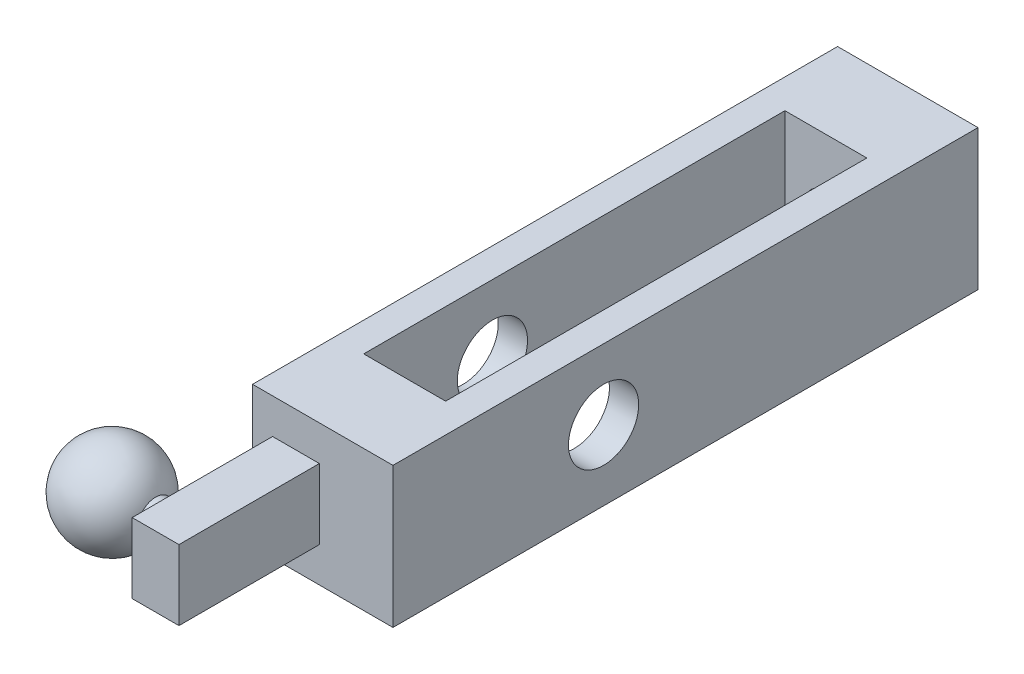
ISO-10303-21;
HEADER;
FILE_DESCRIPTION(('STEP AP214'),'2;1');
FILE_NAME('part.step','',(''),(''),'','','');
FILE_SCHEMA(('AUTOMOTIVE_DESIGN { 1 0 10303 214 1 1 1 1 }'));
ENDSEC;
DATA;
#1=APPLICATION_CONTEXT('core data for automotive mechanical design processes');
#2=APPLICATION_PROTOCOL_DEFINITION('international standard','automotive_design',2000,#1);
#3=PRODUCT_CONTEXT('',#1,'mechanical');
#4=PRODUCT('Part','Part','',(#3));
#5=PRODUCT_RELATED_PRODUCT_CATEGORY('part','',(#4));
#6=PRODUCT_DEFINITION_FORMATION('','',#4);
#7=PRODUCT_DEFINITION_CONTEXT('part definition',#1,'design');
#8=PRODUCT_DEFINITION('design','',#6,#7);
#9=PRODUCT_DEFINITION_SHAPE('','',#8);
#10=(LENGTH_UNIT() NAMED_UNIT(*) SI_UNIT(.MILLI.,.METRE.));
#11=(NAMED_UNIT(*) PLANE_ANGLE_UNIT() SI_UNIT($,.RADIAN.));
#12=(NAMED_UNIT(*) SI_UNIT($,.STERADIAN.) SOLID_ANGLE_UNIT());
#13=UNCERTAINTY_MEASURE_WITH_UNIT(LENGTH_MEASURE(1.E-05),#10,'distance_accuracy_value','');
#14=(GEOMETRIC_REPRESENTATION_CONTEXT(3) GLOBAL_UNCERTAINTY_ASSIGNED_CONTEXT((#13)) GLOBAL_UNIT_ASSIGNED_CONTEXT((#10,
#11,#12)) REPRESENTATION_CONTEXT('',''));
#15=CARTESIAN_POINT('',(0.,0.,0.));
#16=DIRECTION('',(0.,0.,1.));
#17=DIRECTION('',(1.,0.,0.));
#18=AXIS2_PLACEMENT_3D('',#15,#16,#17);
#19=CARTESIAN_POINT('',(3.,-3.,25.));
#20=DIRECTION('',(0.,1.,0.));
#21=DIRECTION('',(-1.,0.,0.));
#22=AXIS2_PLACEMENT_3D('',#19,#20,#21);
#23=PLANE('',#22);
#24=DIRECTION('',(1.,0.,0.));
#25=VECTOR('',#24,1.);
#26=CARTESIAN_POINT('',(3.,-3.,0.));
#27=LINE('',#26,#25);
#28=CARTESIAN_POINT('',(-3.,-3.,0.));
#29=VERTEX_POINT('',#28);
#30=CARTESIAN_POINT('',(3.,-3.,0.));
#31=VERTEX_POINT('',#30);
#32=EDGE_CURVE('E218',#29,#31,#27,.T.);
#33=ORIENTED_EDGE('',*,*,#32,.T.);
#34=DIRECTION('',(0.,0.,-1.));
#35=VECTOR('',#34,1.);
#36=CARTESIAN_POINT('',(3.,-3.,25.));
#37=LINE('',#36,#35);
#38=CARTESIAN_POINT('',(3.,-3.,25.));
#39=VERTEX_POINT('',#38);
#40=EDGE_CURVE('E228',#39,#31,#37,.T.);
#41=ORIENTED_EDGE('',*,*,#40,.F.);
#42=DIRECTION('',(1.,0.,0.));
#43=VECTOR('',#42,1.);
#44=CARTESIAN_POINT('',(3.,-3.,25.));
#45=LINE('',#44,#43);
#46=CARTESIAN_POINT('',(-3.,-3.,25.));
#47=VERTEX_POINT('',#46);
#48=EDGE_CURVE('E208',#47,#39,#45,.T.);
#49=ORIENTED_EDGE('',*,*,#48,.F.);
#50=DIRECTION('',(0.,0.,-1.));
#51=VECTOR('',#50,1.);
#52=CARTESIAN_POINT('',(-3.,-3.,25.));
#53=LINE('',#52,#51);
#54=EDGE_CURVE('E50',#47,#29,#53,.T.);
#55=ORIENTED_EDGE('',*,*,#54,.T.);
#56=EDGE_LOOP('',(#33,#41,#49,#55));
#57=FACE_BOUND('',#56,.T.);
#58=DIRECTION('',(1.,0.,0.));
#59=VECTOR('',#58,1.);
#60=CARTESIAN_POINT('',(3.,-3.,3.5));
#61=LINE('',#60,#59);
#62=CARTESIAN_POINT('',(-1.75,-3.,3.5));
#63=VERTEX_POINT('',#62);
#64=CARTESIAN_POINT('',(1.75,-3.,3.5));
#65=VERTEX_POINT('',#64);
#66=EDGE_CURVE('E135',#63,#65,#61,.T.);
#67=ORIENTED_EDGE('',*,*,#66,.F.);
#68=DIRECTION('',(0.,0.,-1.));
#69=VECTOR('',#68,1.);
#70=CARTESIAN_POINT('',(-1.75,-3.,25.));
#71=LINE('',#70,#69);
#72=CARTESIAN_POINT('',(-1.75,-3.,21.5));
#73=VERTEX_POINT('',#72);
#74=EDGE_CURVE('E138',#73,#63,#71,.T.);
#75=ORIENTED_EDGE('',*,*,#74,.F.);
#76=DIRECTION('',(-1.,0.,0.));
#77=VECTOR('',#76,1.);
#78=CARTESIAN_POINT('',(3.,-3.,21.5));
#79=LINE('',#78,#77);
#80=CARTESIAN_POINT('',(1.75,-3.,21.5));
#81=VERTEX_POINT('',#80);
#82=EDGE_CURVE('E167',#81,#73,#79,.T.);
#83=ORIENTED_EDGE('',*,*,#82,.F.);
#84=DIRECTION('',(0.,0.,1.));
#85=VECTOR('',#84,1.);
#86=CARTESIAN_POINT('',(1.75,-3.,25.));
#87=LINE('',#86,#85);
#88=EDGE_CURVE('E169',#65,#81,#87,.T.);
#89=ORIENTED_EDGE('',*,*,#88,.F.);
#90=EDGE_LOOP('',(#67,#75,#83,#89));
#91=FACE_BOUND('',#90,.T.);
#92=ADVANCED_FACE('F41',(#57,#91),#23,.F.);
#93=CARTESIAN_POINT('',(3.,3.,25.));
#94=DIRECTION('',(0.,-1.,0.));
#95=DIRECTION('',(1.,0.,0.));
#96=AXIS2_PLACEMENT_3D('',#93,#94,#95);
#97=PLANE('',#96);
#98=DIRECTION('',(-1.,0.,0.));
#99=VECTOR('',#98,1.);
#100=CARTESIAN_POINT('',(3.,3.,0.));
#101=LINE('',#100,#99);
#102=CARTESIAN_POINT('',(3.,3.,0.));
#103=VERTEX_POINT('',#102);
#104=CARTESIAN_POINT('',(-3.,3.,0.));
#105=VERTEX_POINT('',#104);
#106=EDGE_CURVE('E209',#103,#105,#101,.T.);
#107=ORIENTED_EDGE('',*,*,#106,.T.);
#108=DIRECTION('',(0.,0.,-1.));
#109=VECTOR('',#108,1.);
#110=CARTESIAN_POINT('',(-3.,3.,25.));
#111=LINE('',#110,#109);
#112=CARTESIAN_POINT('',(-3.,3.,25.));
#113=VERTEX_POINT('',#112);
#114=EDGE_CURVE('E215',#113,#105,#111,.T.);
#115=ORIENTED_EDGE('',*,*,#114,.F.);
#116=DIRECTION('',(-1.,0.,0.));
#117=VECTOR('',#116,1.);
#118=CARTESIAN_POINT('',(3.,3.,25.));
#119=LINE('',#118,#117);
#120=CARTESIAN_POINT('',(3.,3.,25.));
#121=VERTEX_POINT('',#120);
#122=EDGE_CURVE('E213',#121,#113,#119,.T.);
#123=ORIENTED_EDGE('',*,*,#122,.F.);
#124=DIRECTION('',(0.,0.,-1.));
#125=VECTOR('',#124,1.);
#126=CARTESIAN_POINT('',(3.,3.,25.));
#127=LINE('',#126,#125);
#128=EDGE_CURVE('E225',#121,#103,#127,.T.);
#129=ORIENTED_EDGE('',*,*,#128,.T.);
#130=EDGE_LOOP('',(#107,#115,#123,#129));
#131=FACE_BOUND('',#130,.T.);
#132=DIRECTION('',(1.,0.,0.));
#133=VECTOR('',#132,1.);
#134=CARTESIAN_POINT('',(-1.75,3.,3.5));
#135=LINE('',#134,#133);
#136=CARTESIAN_POINT('',(-1.75,3.,3.5));
#137=VERTEX_POINT('',#136);
#138=CARTESIAN_POINT('',(1.75,3.,3.5));
#139=VERTEX_POINT('',#138);
#140=EDGE_CURVE('E66',#137,#139,#135,.T.);
#141=ORIENTED_EDGE('',*,*,#140,.T.);
#142=DIRECTION('',(0.,0.,1.));
#143=VECTOR('',#142,1.);
#144=CARTESIAN_POINT('',(1.75,3.,3.5));
#145=LINE('',#144,#143);
#146=CARTESIAN_POINT('',(1.75,3.,21.5));
#147=VERTEX_POINT('',#146);
#148=EDGE_CURVE('E142',#139,#147,#145,.T.);
#149=ORIENTED_EDGE('',*,*,#148,.T.);
#150=DIRECTION('',(-1.,0.,0.));
#151=VECTOR('',#150,1.);
#152=CARTESIAN_POINT('',(-1.75,3.,21.5));
#153=LINE('',#152,#151);
#154=CARTESIAN_POINT('',(-1.75,3.,21.5));
#155=VERTEX_POINT('',#154);
#156=EDGE_CURVE('E148',#147,#155,#153,.T.);
#157=ORIENTED_EDGE('',*,*,#156,.T.);
#158=DIRECTION('',(0.,0.,-1.));
#159=VECTOR('',#158,1.);
#160=CARTESIAN_POINT('',(-1.75,3.,3.5));
#161=LINE('',#160,#159);
#162=EDGE_CURVE('E152',#155,#137,#161,.T.);
#163=ORIENTED_EDGE('',*,*,#162,.T.);
#164=EDGE_LOOP('',(#141,#149,#157,#163));
#165=FACE_BOUND('',#164,.T.);
#166=ADVANCED_FACE('F151',(#131,#165),#97,.F.);
#167=CARTESIAN_POINT('',(0.,0.,25.));
#168=DIRECTION('',(0.,0.,1.));
#169=DIRECTION('',(1.,0.,0.));
#170=AXIS2_PLACEMENT_3D('',#167,#168,#169);
#171=PLANE('',#170);
#172=DIRECTION('',(0.,-1.,0.));
#173=VECTOR('',#172,1.);
#174=CARTESIAN_POINT('',(-3.,-3.,25.));
#175=LINE('',#174,#173);
#176=EDGE_CURVE('E205',#113,#47,#175,.T.);
#177=ORIENTED_EDGE('',*,*,#176,.T.);
#178=ORIENTED_EDGE('',*,*,#48,.T.);
#179=DIRECTION('',(0.,1.,0.));
#180=VECTOR('',#179,1.);
#181=CARTESIAN_POINT('',(3.,-3.,25.));
#182=LINE('',#181,#180);
#183=EDGE_CURVE('E211',#39,#121,#182,.T.);
#184=ORIENTED_EDGE('',*,*,#183,.T.);
#185=ORIENTED_EDGE('',*,*,#122,.T.);
#186=EDGE_LOOP('',(#177,#178,#184,#185));
#187=FACE_BOUND('',#186,.T.);
#188=DIRECTION('',(-1.,0.,0.));
#189=VECTOR('',#188,1.);
#190=CARTESIAN_POINT('',(-2.14479354998716,1.49545918544692,25.));
#191=LINE('',#190,#189);
#192=CARTESIAN_POINT('',(-0.144793549987163,1.49545918544692,25.));
#193=VERTEX_POINT('',#192);
#194=CARTESIAN_POINT('',(-2.14479354998716,1.49545918544692,25.));
#195=VERTEX_POINT('',#194);
#196=EDGE_CURVE('E189',#193,#195,#191,.T.);
#197=ORIENTED_EDGE('',*,*,#196,.F.);
#198=DIRECTION('',(0.,1.,0.));
#199=VECTOR('',#198,1.);
#200=CARTESIAN_POINT('',(-0.144793549987163,1.49545918544692,25.));
#201=LINE('',#200,#199);
#202=CARTESIAN_POINT('',(-0.144793549987163,-1.50454081455308,25.));
#203=VERTEX_POINT('',#202);
#204=EDGE_CURVE('E175',#203,#193,#201,.T.);
#205=ORIENTED_EDGE('',*,*,#204,.F.);
#206=DIRECTION('',(1.,0.,0.));
#207=VECTOR('',#206,1.);
#208=CARTESIAN_POINT('',(-2.14479354998716,-1.50454081455308,25.));
#209=LINE('',#208,#207);
#210=CARTESIAN_POINT('',(-2.14479354998716,-1.50454081455308,25.));
#211=VERTEX_POINT('',#210);
#212=EDGE_CURVE('E180',#211,#203,#209,.T.);
#213=ORIENTED_EDGE('',*,*,#212,.F.);
#214=DIRECTION('',(0.,-1.,0.));
#215=VECTOR('',#214,1.);
#216=CARTESIAN_POINT('',(-2.14479354998716,1.49545918544692,25.));
#217=LINE('',#216,#215);
#218=EDGE_CURVE('E191',#195,#211,#217,.T.);
#219=ORIENTED_EDGE('',*,*,#218,.F.);
#220=EDGE_LOOP('',(#197,#205,#213,#219));
#221=FACE_BOUND('',#220,.T.);
#222=ADVANCED_FACE('F272',(#187,#221),#171,.T.);
#223=CARTESIAN_POINT('',(-3.,-3.,25.));
#224=DIRECTION('',(1.,0.,0.));
#225=DIRECTION('',(0.,0.,-1.));
#226=AXIS2_PLACEMENT_3D('',#223,#224,#225);
#227=PLANE('',#226);
#228=CARTESIAN_POINT('',(-3.,0.,16.));
#229=DIRECTION('',(-1.,0.,0.));
#230=DIRECTION('',(0.,0.,1.));
#231=AXIS2_PLACEMENT_3D('',#228,#229,#230);
#232=CIRCLE('',#231,1.5);
#233=CARTESIAN_POINT('',(-3.,0.,17.5));
#234=VERTEX_POINT('',#233);
#235=EDGE_CURVE('E234',#234,#234,#232,.T.);
#236=ORIENTED_EDGE('',*,*,#235,.F.);
#237=EDGE_LOOP('',(#236));
#238=FACE_BOUND('',#237,.T.);
#239=DIRECTION('',(0.,-1.,0.));
#240=VECTOR('',#239,1.);
#241=CARTESIAN_POINT('',(-3.,-3.,0.));
#242=LINE('',#241,#240);
#243=EDGE_CURVE('E204',#105,#29,#242,.T.);
#244=ORIENTED_EDGE('',*,*,#243,.T.);
#245=ORIENTED_EDGE('',*,*,#54,.F.);
#246=ORIENTED_EDGE('',*,*,#176,.F.);
#247=ORIENTED_EDGE('',*,*,#114,.T.);
#248=EDGE_LOOP('',(#244,#245,#246,#247));
#249=FACE_BOUND('',#248,.T.);
#250=ADVANCED_FACE('F43',(#238,#249),#227,.F.);
#251=CARTESIAN_POINT('',(3.,-3.,25.));
#252=DIRECTION('',(-1.,0.,0.));
#253=DIRECTION('',(0.,0.,1.));
#254=AXIS2_PLACEMENT_3D('',#251,#252,#253);
#255=PLANE('',#254);
#256=CARTESIAN_POINT('',(3.,0.,16.));
#257=DIRECTION('',(-1.,0.,0.));
#258=DIRECTION('',(0.,0.,1.));
#259=AXIS2_PLACEMENT_3D('',#256,#257,#258);
#260=CIRCLE('',#259,1.5);
#261=CARTESIAN_POINT('',(3.,0.,17.5));
#262=VERTEX_POINT('',#261);
#263=EDGE_CURVE('E153',#262,#262,#260,.T.);
#264=ORIENTED_EDGE('',*,*,#263,.T.);
#265=EDGE_LOOP('',(#264));
#266=FACE_BOUND('',#265,.T.);
#267=DIRECTION('',(0.,1.,0.));
#268=VECTOR('',#267,1.);
#269=CARTESIAN_POINT('',(3.,-3.,0.));
#270=LINE('',#269,#268);
#271=EDGE_CURVE('E220',#31,#103,#270,.T.);
#272=ORIENTED_EDGE('',*,*,#271,.T.);
#273=ORIENTED_EDGE('',*,*,#128,.F.);
#274=ORIENTED_EDGE('',*,*,#183,.F.);
#275=ORIENTED_EDGE('',*,*,#40,.T.);
#276=EDGE_LOOP('',(#272,#273,#274,#275));
#277=FACE_BOUND('',#276,.T.);
#278=ADVANCED_FACE('F254',(#266,#277),#255,.F.);
#279=CARTESIAN_POINT('',(0.,0.,0.));
#280=DIRECTION('',(0.,0.,1.));
#281=DIRECTION('',(1.,0.,0.));
#282=AXIS2_PLACEMENT_3D('',#279,#280,#281);
#283=PLANE('',#282);
#284=CARTESIAN_POINT('',(0.,0.,0.));
#285=DIRECTION('',(0.,0.,-1.));
#286=DIRECTION('',(-1.,0.,0.));
#287=AXIS2_PLACEMENT_3D('',#284,#285,#286);
#288=CIRCLE('',#287,0.9);
#289=CARTESIAN_POINT('',(-0.9,0.,0.));
#290=VERTEX_POINT('',#289);
#291=EDGE_CURVE('E243',#290,#290,#288,.T.);
#292=ORIENTED_EDGE('',*,*,#291,.F.);
#293=EDGE_LOOP('',(#292));
#294=FACE_BOUND('',#293,.T.);
#295=ORIENTED_EDGE('',*,*,#243,.F.);
#296=ORIENTED_EDGE('',*,*,#106,.F.);
#297=ORIENTED_EDGE('',*,*,#271,.F.);
#298=ORIENTED_EDGE('',*,*,#32,.F.);
#299=EDGE_LOOP('',(#295,#296,#297,#298));
#300=FACE_BOUND('',#299,.T.);
#301=ADVANCED_FACE('F250',(#294,#300),#283,.F.);
#302=CARTESIAN_POINT('',(-0.144793549987163,1.49545918544692,31.));
#303=DIRECTION('',(-1.,0.,0.));
#304=DIRECTION('',(0.,-1.,0.));
#305=AXIS2_PLACEMENT_3D('',#302,#303,#304);
#306=PLANE('',#305);
#307=ORIENTED_EDGE('',*,*,#204,.T.);
#308=DIRECTION('',(0.,0.,-1.));
#309=VECTOR('',#308,1.);
#310=CARTESIAN_POINT('',(-0.144793549987163,1.49545918544692,31.));
#311=LINE('',#310,#309);
#312=CARTESIAN_POINT('',(-0.144793549987163,1.49545918544692,31.));
#313=VERTEX_POINT('',#312);
#314=EDGE_CURVE('E202',#313,#193,#311,.T.);
#315=ORIENTED_EDGE('',*,*,#314,.F.);
#316=DIRECTION('',(0.,1.,0.));
#317=VECTOR('',#316,1.);
#318=CARTESIAN_POINT('',(-0.144793549987163,1.49545918544692,31.));
#319=LINE('',#318,#317);
#320=CARTESIAN_POINT('',(-0.144793549987163,-1.50454081455308,31.));
#321=VERTEX_POINT('',#320);
#322=EDGE_CURVE('E176',#321,#313,#319,.T.);
#323=ORIENTED_EDGE('',*,*,#322,.F.);
#324=DIRECTION('',(0.,0.,-1.));
#325=VECTOR('',#324,1.);
#326=CARTESIAN_POINT('',(-0.144793549987163,-1.50454081455308,31.));
#327=LINE('',#326,#325);
#328=EDGE_CURVE('E186',#321,#203,#327,.T.);
#329=ORIENTED_EDGE('',*,*,#328,.T.);
#330=EDGE_LOOP('',(#307,#315,#323,#329));
#331=FACE_BOUND('',#330,.T.);
#332=ADVANCED_FACE('F253',(#331),#306,.F.);
#333=CARTESIAN_POINT('',(-2.14479354998716,1.49545918544692,31.));
#334=DIRECTION('',(0.,-1.,0.));
#335=DIRECTION('',(1.,0.,0.));
#336=AXIS2_PLACEMENT_3D('',#333,#334,#335);
#337=PLANE('',#336);
#338=ORIENTED_EDGE('',*,*,#196,.T.);
#339=DIRECTION('',(0.,0.,-1.));
#340=VECTOR('',#339,1.);
#341=CARTESIAN_POINT('',(-2.14479354998716,1.49545918544692,31.));
#342=LINE('',#341,#340);
#343=CARTESIAN_POINT('',(-2.14479354998716,1.49545918544692,31.));
#344=VERTEX_POINT('',#343);
#345=EDGE_CURVE('E199',#344,#195,#342,.T.);
#346=ORIENTED_EDGE('',*,*,#345,.F.);
#347=DIRECTION('',(-1.,0.,0.));
#348=VECTOR('',#347,1.);
#349=CARTESIAN_POINT('',(-2.14479354998716,1.49545918544692,31.));
#350=LINE('',#349,#348);
#351=EDGE_CURVE('E179',#313,#344,#350,.T.);
#352=ORIENTED_EDGE('',*,*,#351,.F.);
#353=ORIENTED_EDGE('',*,*,#314,.T.);
#354=EDGE_LOOP('',(#338,#346,#352,#353));
#355=FACE_BOUND('',#354,.T.);
#356=ADVANCED_FACE('F282',(#355),#337,.F.);
#357=CARTESIAN_POINT('',(-2.14479354998716,1.49545918544692,31.));
#358=DIRECTION('',(1.,0.,0.));
#359=DIRECTION('',(0.,1.,0.));
#360=AXIS2_PLACEMENT_3D('',#357,#358,#359);
#361=PLANE('',#360);
#362=CARTESIAN_POINT('',(-2.14479354998716,0.,29.));
#363=DIRECTION('',(1.,0.,0.));
#364=DIRECTION('',(0.,1.,0.));
#365=AXIS2_PLACEMENT_3D('',#362,#363,#364);
#366=CIRCLE('',#365,0.750000000000002);
#367=CARTESIAN_POINT('',(-2.14479354998716,0.750000000000002,29.));
#368=VERTEX_POINT('',#367);
#369=EDGE_CURVE('E11',#368,#368,#366,.F.);
#370=ORIENTED_EDGE('',*,*,#369,.F.);
#371=EDGE_LOOP('',(#370));
#372=FACE_BOUND('',#371,.T.);
#373=ORIENTED_EDGE('',*,*,#218,.T.);
#374=DIRECTION('',(0.,0.,-1.));
#375=VECTOR('',#374,1.);
#376=CARTESIAN_POINT('',(-2.14479354998716,-1.50454081455308,31.));
#377=LINE('',#376,#375);
#378=CARTESIAN_POINT('',(-2.14479354998716,-1.50454081455308,31.));
#379=VERTEX_POINT('',#378);
#380=EDGE_CURVE('E197',#379,#211,#377,.T.);
#381=ORIENTED_EDGE('',*,*,#380,.F.);
#382=DIRECTION('',(0.,-1.,0.));
#383=VECTOR('',#382,1.);
#384=CARTESIAN_POINT('',(-2.14479354998716,1.49545918544692,31.));
#385=LINE('',#384,#383);
#386=EDGE_CURVE('E182',#344,#379,#385,.T.);
#387=ORIENTED_EDGE('',*,*,#386,.F.);
#388=ORIENTED_EDGE('',*,*,#345,.T.);
#389=EDGE_LOOP('',(#373,#381,#387,#388));
#390=FACE_BOUND('',#389,.T.);
#391=ADVANCED_FACE('F286',(#372,#390),#361,.F.);
#392=CARTESIAN_POINT('',(-2.14479354998716,-1.50454081455308,31.));
#393=DIRECTION('',(0.,1.,0.));
#394=DIRECTION('',(-1.,0.,0.));
#395=AXIS2_PLACEMENT_3D('',#392,#393,#394);
#396=PLANE('',#395);
#397=ORIENTED_EDGE('',*,*,#212,.T.);
#398=ORIENTED_EDGE('',*,*,#328,.F.);
#399=DIRECTION('',(1.,0.,0.));
#400=VECTOR('',#399,1.);
#401=CARTESIAN_POINT('',(-2.14479354998716,-1.50454081455308,31.));
#402=LINE('',#401,#400);
#403=EDGE_CURVE('E184',#379,#321,#402,.T.);
#404=ORIENTED_EDGE('',*,*,#403,.F.);
#405=ORIENTED_EDGE('',*,*,#380,.T.);
#406=EDGE_LOOP('',(#397,#398,#404,#405));
#407=FACE_BOUND('',#406,.T.);
#408=ADVANCED_FACE('F295',(#407),#396,.F.);
#409=CARTESIAN_POINT('',(0.,0.,31.));
#410=DIRECTION('',(0.,0.,1.));
#411=DIRECTION('',(1.,0.,0.));
#412=AXIS2_PLACEMENT_3D('',#409,#410,#411);
#413=PLANE('',#412);
#414=ORIENTED_EDGE('',*,*,#322,.T.);
#415=ORIENTED_EDGE('',*,*,#351,.T.);
#416=ORIENTED_EDGE('',*,*,#386,.T.);
#417=ORIENTED_EDGE('',*,*,#403,.T.);
#418=EDGE_LOOP('',(#414,#415,#416,#417));
#419=FACE_BOUND('',#418,.T.);
#420=ADVANCED_FACE('F290',(#419),#413,.T.);
#421=CARTESIAN_POINT('',(-3.14479354998716,0.,29.));
#422=DIRECTION('',(1.,0.,0.));
#423=DIRECTION('',(0.,1.,0.));
#424=AXIS2_PLACEMENT_3D('',#421,#422,#423);
#425=CYLINDRICAL_SURFACE('',#424,0.750000000000002);
#426=CARTESIAN_POINT('',(-3.14479354998716,0.,29.));
#427=DIRECTION('',(-1.,0.,0.));
#428=DIRECTION('',(0.,-1.,0.));
#429=AXIS2_PLACEMENT_3D('',#426,#427,#428);
#430=CIRCLE('',#429,0.750000000000002);
#431=CARTESIAN_POINT('',(-3.14479354998716,-0.750000000000002,29.));
#432=VERTEX_POINT('',#431);
#433=EDGE_CURVE('E172',#432,#432,#430,.T.);
#434=ORIENTED_EDGE('',*,*,#433,.F.);
#435=EDGE_LOOP('',(#434));
#436=FACE_BOUND('',#435,.T.);
#437=ORIENTED_EDGE('',*,*,#369,.T.);
#438=EDGE_LOOP('',(#437));
#439=FACE_BOUND('',#438,.T.);
#440=ADVANCED_FACE('F302',(#436,#439),#425,.T.);
#441=CARTESIAN_POINT('',(-4.99884317176108,0.,29.));
#442=DIRECTION('',(1.,0.,0.));
#443=DIRECTION('',(0.,0.,-1.));
#444=AXIS2_PLACEMENT_3D('',#441,#442,#443);
#445=SPHERICAL_SURFACE('',#444,2.);
#446=ORIENTED_EDGE('',*,*,#433,.T.);
#447=EDGE_LOOP('',(#446));
#448=FACE_BOUND('',#447,.T.);
#449=ADVANCED_FACE('F360',(#448),#445,.T.);
#450=CARTESIAN_POINT('',(-1.75,-5.,3.5));
#451=DIRECTION('',(0.,0.,1.));
#452=DIRECTION('',(1.,0.,0.));
#453=AXIS2_PLACEMENT_3D('',#450,#451,#452);
#454=PLANE('',#453);
#455=CARTESIAN_POINT('',(0.,0.,3.5));
#456=DIRECTION('',(0.,0.,1.));
#457=DIRECTION('',(1.,0.,0.));
#458=AXIS2_PLACEMENT_3D('',#455,#456,#457);
#459=CIRCLE('',#458,0.9);
#460=CARTESIAN_POINT('',(0.9,0.,3.5));
#461=VERTEX_POINT('',#460);
#462=EDGE_CURVE('E45',#461,#461,#459,.T.);
#463=ORIENTED_EDGE('',*,*,#462,.F.);
#464=EDGE_LOOP('',(#463));
#465=FACE_BOUND('',#464,.T.);
#466=ORIENTED_EDGE('',*,*,#66,.T.);
#467=DIRECTION('',(0.,1.,0.));
#468=VECTOR('',#467,1.);
#469=CARTESIAN_POINT('',(1.75,-5.,3.5));
#470=LINE('',#469,#468);
#471=EDGE_CURVE('E131',#65,#139,#470,.T.);
#472=ORIENTED_EDGE('',*,*,#471,.T.);
#473=ORIENTED_EDGE('',*,*,#140,.F.);
#474=DIRECTION('',(0.,1.,0.));
#475=VECTOR('',#474,1.);
#476=CARTESIAN_POINT('',(-1.75,-5.,3.5));
#477=LINE('',#476,#475);
#478=EDGE_CURVE('E162',#63,#137,#477,.T.);
#479=ORIENTED_EDGE('',*,*,#478,.F.);
#480=EDGE_LOOP('',(#466,#472,#473,#479));
#481=FACE_BOUND('',#480,.T.);
#482=ADVANCED_FACE('F133',(#465,#481),#454,.T.);
#483=CARTESIAN_POINT('',(1.75,-5.,3.5));
#484=DIRECTION('',(-1.,0.,0.));
#485=DIRECTION('',(0.,-1.,0.));
#486=AXIS2_PLACEMENT_3D('',#483,#484,#485);
#487=PLANE('',#486);
#488=CARTESIAN_POINT('',(1.75,0.,16.));
#489=DIRECTION('',(-1.,0.,0.));
#490=DIRECTION('',(0.,-1.,0.));
#491=AXIS2_PLACEMENT_3D('',#488,#489,#490);
#492=CIRCLE('',#491,1.5);
#493=CARTESIAN_POINT('',(1.75,-1.5,16.));
#494=VERTEX_POINT('',#493);
#495=EDGE_CURVE('E156',#494,#494,#492,.T.);
#496=ORIENTED_EDGE('',*,*,#495,.F.);
#497=EDGE_LOOP('',(#496));
#498=FACE_BOUND('',#497,.T.);
#499=ORIENTED_EDGE('',*,*,#88,.T.);
#500=DIRECTION('',(0.,1.,0.));
#501=VECTOR('',#500,1.);
#502=CARTESIAN_POINT('',(1.75,-5.,21.5));
#503=LINE('',#502,#501);
#504=EDGE_CURVE('E139',#81,#147,#503,.T.);
#505=ORIENTED_EDGE('',*,*,#504,.T.);
#506=ORIENTED_EDGE('',*,*,#148,.F.);
#507=ORIENTED_EDGE('',*,*,#471,.F.);
#508=EDGE_LOOP('',(#499,#505,#506,#507));
#509=FACE_BOUND('',#508,.T.);
#510=ADVANCED_FACE('F143',(#498,#509),#487,.T.);
#511=CARTESIAN_POINT('',(-1.75,-5.,21.5));
#512=DIRECTION('',(0.,0.,-1.));
#513=DIRECTION('',(-1.,0.,0.));
#514=AXIS2_PLACEMENT_3D('',#511,#512,#513);
#515=PLANE('',#514);
#516=ORIENTED_EDGE('',*,*,#82,.T.);
#517=DIRECTION('',(0.,1.,0.));
#518=VECTOR('',#517,1.);
#519=CARTESIAN_POINT('',(-1.75,-5.,21.5));
#520=LINE('',#519,#518);
#521=EDGE_CURVE('E58',#73,#155,#520,.T.);
#522=ORIENTED_EDGE('',*,*,#521,.T.);
#523=ORIENTED_EDGE('',*,*,#156,.F.);
#524=ORIENTED_EDGE('',*,*,#504,.F.);
#525=EDGE_LOOP('',(#516,#522,#523,#524));
#526=FACE_BOUND('',#525,.T.);
#527=ADVANCED_FACE('F395',(#526),#515,.T.);
#528=CARTESIAN_POINT('',(-1.75,-5.,3.5));
#529=DIRECTION('',(1.,0.,0.));
#530=DIRECTION('',(0.,1.,0.));
#531=AXIS2_PLACEMENT_3D('',#528,#529,#530);
#532=PLANE('',#531);
#533=CARTESIAN_POINT('',(-1.75,0.,16.));
#534=DIRECTION('',(1.,0.,0.));
#535=DIRECTION('',(0.,1.,0.));
#536=AXIS2_PLACEMENT_3D('',#533,#534,#535);
#537=CIRCLE('',#536,1.5);
#538=CARTESIAN_POINT('',(-1.75,1.5,16.));
#539=VERTEX_POINT('',#538);
#540=EDGE_CURVE('E232',#539,#539,#537,.T.);
#541=ORIENTED_EDGE('',*,*,#540,.F.);
#542=EDGE_LOOP('',(#541));
#543=FACE_BOUND('',#542,.T.);
#544=ORIENTED_EDGE('',*,*,#74,.T.);
#545=ORIENTED_EDGE('',*,*,#478,.T.);
#546=ORIENTED_EDGE('',*,*,#162,.F.);
#547=ORIENTED_EDGE('',*,*,#521,.F.);
#548=EDGE_LOOP('',(#544,#545,#546,#547));
#549=FACE_BOUND('',#548,.T.);
#550=ADVANCED_FACE('F403',(#543,#549),#532,.T.);
#551=CARTESIAN_POINT('',(5.,0.,16.));
#552=DIRECTION('',(-1.,0.,0.));
#553=DIRECTION('',(0.,0.,1.));
#554=AXIS2_PLACEMENT_3D('',#551,#552,#553);
#555=CYLINDRICAL_SURFACE('',#554,1.5);
#556=ORIENTED_EDGE('',*,*,#540,.T.);
#557=EDGE_LOOP('',(#556));
#558=FACE_BOUND('',#557,.T.);
#559=ORIENTED_EDGE('',*,*,#235,.T.);
#560=EDGE_LOOP('',(#559));
#561=FACE_BOUND('',#560,.T.);
#562=ADVANCED_FACE('F412',(#558,#561),#555,.F.);
#563=ORIENTED_EDGE('',*,*,#495,.T.);
#564=EDGE_LOOP('',(#563));
#565=FACE_BOUND('',#564,.T.);
#566=ORIENTED_EDGE('',*,*,#263,.F.);
#567=EDGE_LOOP('',(#566));
#568=FACE_BOUND('',#567,.T.);
#569=ADVANCED_FACE('F421',(#565,#568),#555,.F.);
#570=CARTESIAN_POINT('',(0.,0.,8.));
#571=DIRECTION('',(0.,0.,-1.));
#572=DIRECTION('',(-1.,0.,0.));
#573=AXIS2_PLACEMENT_3D('',#570,#571,#572);
#574=CYLINDRICAL_SURFACE('',#573,0.9);
#575=ORIENTED_EDGE('',*,*,#462,.T.);
#576=EDGE_LOOP('',(#575));
#577=FACE_BOUND('',#576,.T.);
#578=ORIENTED_EDGE('',*,*,#291,.T.);
#579=EDGE_LOOP('',(#578));
#580=FACE_BOUND('',#579,.T.);
#581=ADVANCED_FACE('F248',(#577,#580),#574,.F.);
#582=CLOSED_SHELL('',(#92,#166,#222,#250,#278,#301,#332,#356,#391,#408,#420,#440,#449,#482,#510,
#527,#550,#562,#569,#581));
#583=MANIFOLD_SOLID_BREP('B2',#582);
#584=ADVANCED_BREP_SHAPE_REPRESENTATION('',(#18,#583),#14);
#585=SHAPE_DEFINITION_REPRESENTATION(#9,#584);
ENDSEC;
END-ISO-10303-21;
